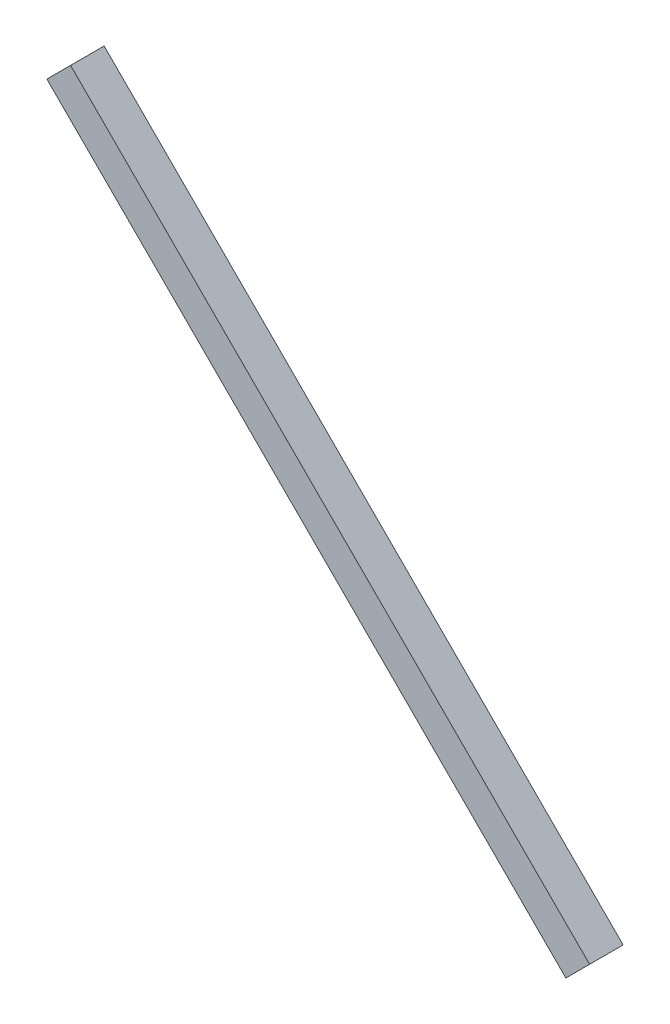
ISO-10303-21;
HEADER;
FILE_DESCRIPTION(('STEP AP214'),'2;1');
FILE_NAME('part.step','',(''),(''),'','','');
FILE_SCHEMA(('AUTOMOTIVE_DESIGN { 1 0 10303 214 1 1 1 1 }'));
ENDSEC;
DATA;
#1=APPLICATION_CONTEXT('core data for automotive mechanical design processes');
#2=APPLICATION_PROTOCOL_DEFINITION('international standard','automotive_design',2000,#1);
#3=PRODUCT_CONTEXT('',#1,'mechanical');
#4=PRODUCT('Part','Part','',(#3));
#5=PRODUCT_RELATED_PRODUCT_CATEGORY('part','',(#4));
#6=PRODUCT_DEFINITION_FORMATION('','',#4);
#7=PRODUCT_DEFINITION_CONTEXT('part definition',#1,'design');
#8=PRODUCT_DEFINITION('design','',#6,#7);
#9=PRODUCT_DEFINITION_SHAPE('','',#8);
#10=(LENGTH_UNIT() NAMED_UNIT(*) SI_UNIT(.MILLI.,.METRE.));
#11=(NAMED_UNIT(*) PLANE_ANGLE_UNIT() SI_UNIT($,.RADIAN.));
#12=(NAMED_UNIT(*) SI_UNIT($,.STERADIAN.) SOLID_ANGLE_UNIT());
#13=UNCERTAINTY_MEASURE_WITH_UNIT(LENGTH_MEASURE(1.E-05),#10,'distance_accuracy_value','');
#14=(GEOMETRIC_REPRESENTATION_CONTEXT(3) GLOBAL_UNCERTAINTY_ASSIGNED_CONTEXT((#13)) GLOBAL_UNIT_ASSIGNED_CONTEXT((#10,
#11,#12)) REPRESENTATION_CONTEXT('',''));
#15=CARTESIAN_POINT('',(0.,0.,0.));
#16=DIRECTION('',(0.,0.,1.));
#17=DIRECTION('',(1.,0.,0.));
#18=AXIS2_PLACEMENT_3D('',#15,#16,#17);
#19=CARTESIAN_POINT('',(324.738023329125,-15.556349186104,92.));
#20=DIRECTION('',(0.707106781186544,-0.707106781186551,0.));
#21=DIRECTION('',(0.,0.,-1.));
#22=AXIS2_PLACEMENT_3D('',#19,#20,#21);
#23=PLANE('',#22);
#24=DIRECTION('',(-0.707106781186551,-0.707106781186544,0.));
#25=VECTOR('',#24,1.);
#26=CARTESIAN_POINT('',(340.294372515229,0.,92.));
#27=LINE('',#26,#25);
#28=CARTESIAN_POINT('',(340.294372515229,0.,92.));
#29=VERTEX_POINT('',#28);
#30=CARTESIAN_POINT('',(324.738023329125,-15.556349186104,92.));
#31=VERTEX_POINT('',#30);
#32=EDGE_CURVE('E38',#29,#31,#27,.T.);
#33=ORIENTED_EDGE('',*,*,#32,.F.);
#34=DIRECTION('',(0.,0.,1.));
#35=VECTOR('',#34,1.);
#36=CARTESIAN_POINT('',(340.294372515229,0.,92.));
#37=LINE('',#36,#35);
#38=CARTESIAN_POINT('',(340.294372515229,0.,114.));
#39=VERTEX_POINT('',#38);
#40=EDGE_CURVE('E11',#29,#39,#37,.T.);
#41=ORIENTED_EDGE('',*,*,#40,.T.);
#42=DIRECTION('',(0.707106781186551,0.707106781186544,0.));
#43=VECTOR('',#42,1.);
#44=CARTESIAN_POINT('',(340.294372515229,0.,114.));
#45=LINE('',#44,#43);
#46=CARTESIAN_POINT('',(324.738023329125,-15.5563491861039,114.));
#47=VERTEX_POINT('',#46);
#48=EDGE_CURVE('E63',#47,#39,#45,.T.);
#49=ORIENTED_EDGE('',*,*,#48,.F.);
#50=DIRECTION('',(0.,0.,1.));
#51=VECTOR('',#50,1.);
#52=CARTESIAN_POINT('',(324.738023329125,-15.556349186104,92.));
#53=LINE('',#52,#51);
#54=EDGE_CURVE('E26',#31,#47,#53,.T.);
#55=ORIENTED_EDGE('',*,*,#54,.F.);
#56=EDGE_LOOP('',(#33,#41,#49,#55));
#57=FACE_BOUND('',#56,.T.);
#58=ADVANCED_FACE('F16',(#57),#23,.T.);
#59=CARTESIAN_POINT('',(-15.556349186104,324.738023329125,92.));
#60=DIRECTION('',(-0.707106781186548,-0.707106781186548,0.));
#61=DIRECTION('',(-0.707106781186548,0.707106781186548,0.));
#62=AXIS2_PLACEMENT_3D('',#59,#60,#61);
#63=PLANE('',#62);
#64=DIRECTION('',(-0.707106781186548,0.707106781186548,0.));
#65=VECTOR('',#64,1.);
#66=CARTESIAN_POINT('',(324.738023329125,-15.556349186104,92.));
#67=LINE('',#66,#65);
#68=CARTESIAN_POINT('',(-15.556349186104,324.738023329125,92.));
#69=VERTEX_POINT('',#68);
#70=EDGE_CURVE('E78',#31,#69,#67,.T.);
#71=ORIENTED_EDGE('',*,*,#70,.F.);
#72=ORIENTED_EDGE('',*,*,#54,.T.);
#73=DIRECTION('',(0.707106781186548,-0.707106781186548,0.));
#74=VECTOR('',#73,1.);
#75=CARTESIAN_POINT('',(324.738023329125,-15.556349186104,114.));
#76=LINE('',#75,#74);
#77=CARTESIAN_POINT('',(-15.556349186104,324.738023329125,114.));
#78=VERTEX_POINT('',#77);
#79=EDGE_CURVE('E71',#78,#47,#76,.T.);
#80=ORIENTED_EDGE('',*,*,#79,.F.);
#81=DIRECTION('',(0.,0.,1.));
#82=VECTOR('',#81,1.);
#83=CARTESIAN_POINT('',(-15.556349186104,324.738023329125,92.));
#84=LINE('',#83,#82);
#85=EDGE_CURVE('E19',#69,#78,#84,.T.);
#86=ORIENTED_EDGE('',*,*,#85,.F.);
#87=EDGE_LOOP('',(#71,#72,#80,#86));
#88=FACE_BOUND('',#87,.T.);
#89=ADVANCED_FACE('F75',(#88),#63,.T.);
#90=CARTESIAN_POINT('',(0.,340.294372515229,92.));
#91=DIRECTION('',(-0.707106781186548,0.707106781186547,0.));
#92=DIRECTION('',(0.,0.,1.));
#93=AXIS2_PLACEMENT_3D('',#90,#91,#92);
#94=PLANE('',#93);
#95=DIRECTION('',(0.707106781186547,0.707106781186548,0.));
#96=VECTOR('',#95,1.);
#97=CARTESIAN_POINT('',(-15.556349186104,324.738023329125,92.));
#98=LINE('',#97,#96);
#99=CARTESIAN_POINT('',(0.,340.294372515229,92.));
#100=VERTEX_POINT('',#99);
#101=EDGE_CURVE('E95',#69,#100,#98,.T.);
#102=ORIENTED_EDGE('',*,*,#101,.F.);
#103=ORIENTED_EDGE('',*,*,#85,.T.);
#104=DIRECTION('',(-0.707106781186547,-0.707106781186548,0.));
#105=VECTOR('',#104,1.);
#106=CARTESIAN_POINT('',(-15.556349186104,324.738023329125,114.));
#107=LINE('',#106,#105);
#108=CARTESIAN_POINT('',(0.,340.294372515229,114.));
#109=VERTEX_POINT('',#108);
#110=EDGE_CURVE('E84',#109,#78,#107,.T.);
#111=ORIENTED_EDGE('',*,*,#110,.F.);
#112=DIRECTION('',(0.,0.,1.));
#113=VECTOR('',#112,1.);
#114=CARTESIAN_POINT('',(0.,340.294372515229,92.));
#115=LINE('',#114,#113);
#116=EDGE_CURVE('E96',#100,#109,#115,.T.);
#117=ORIENTED_EDGE('',*,*,#116,.F.);
#118=EDGE_LOOP('',(#102,#103,#111,#117));
#119=FACE_BOUND('',#118,.T.);
#120=ADVANCED_FACE('F121',(#119),#94,.T.);
#121=CARTESIAN_POINT('',(340.294372515229,0.,92.));
#122=DIRECTION('',(0.707106781186547,0.707106781186548,0.));
#123=DIRECTION('',(0.,0.,-1.));
#124=AXIS2_PLACEMENT_3D('',#121,#122,#123);
#125=PLANE('',#124);
#126=DIRECTION('',(0.707106781186548,-0.707106781186547,0.));
#127=VECTOR('',#126,1.);
#128=CARTESIAN_POINT('',(0.,340.294372515229,92.));
#129=LINE('',#128,#127);
#130=EDGE_CURVE('E72',#100,#29,#129,.T.);
#131=ORIENTED_EDGE('',*,*,#130,.F.);
#132=ORIENTED_EDGE('',*,*,#116,.T.);
#133=DIRECTION('',(-0.707106781186548,0.707106781186547,0.));
#134=VECTOR('',#133,1.);
#135=CARTESIAN_POINT('',(0.,340.294372515229,114.));
#136=LINE('',#135,#134);
#137=EDGE_CURVE('E91',#39,#109,#136,.T.);
#138=ORIENTED_EDGE('',*,*,#137,.F.);
#139=ORIENTED_EDGE('',*,*,#40,.F.);
#140=EDGE_LOOP('',(#131,#132,#138,#139));
#141=FACE_BOUND('',#140,.T.);
#142=ADVANCED_FACE('F122',(#141),#125,.T.);
#143=CARTESIAN_POINT('',(162.369011664562,162.369011664562,114.));
#144=DIRECTION('',(0.,0.,1.));
#145=DIRECTION('',(1.,0.,0.));
#146=AXIS2_PLACEMENT_3D('',#143,#144,#145);
#147=PLANE('',#146);
#148=ORIENTED_EDGE('',*,*,#137,.T.);
#149=ORIENTED_EDGE('',*,*,#110,.T.);
#150=ORIENTED_EDGE('',*,*,#79,.T.);
#151=ORIENTED_EDGE('',*,*,#48,.T.);
#152=EDGE_LOOP('',(#148,#149,#150,#151));
#153=FACE_BOUND('',#152,.T.);
#154=ADVANCED_FACE('F82',(#153),#147,.T.);
#155=CARTESIAN_POINT('',(162.369011664562,162.369011664562,92.));
#156=DIRECTION('',(0.,0.,1.));
#157=DIRECTION('',(1.,0.,0.));
#158=AXIS2_PLACEMENT_3D('',#155,#156,#157);
#159=PLANE('',#158);
#160=ORIENTED_EDGE('',*,*,#130,.T.);
#161=ORIENTED_EDGE('',*,*,#32,.T.);
#162=ORIENTED_EDGE('',*,*,#70,.T.);
#163=ORIENTED_EDGE('',*,*,#101,.T.);
#164=EDGE_LOOP('',(#160,#161,#162,#163));
#165=FACE_BOUND('',#164,.T.);
#166=ADVANCED_FACE('F119',(#165),#159,.F.);
#167=CLOSED_SHELL('',(#58,#89,#120,#142,#154,#166));
#168=MANIFOLD_SOLID_BREP('B1',#167);
#169=ADVANCED_BREP_SHAPE_REPRESENTATION('',(#18,#168),#14);
#170=SHAPE_DEFINITION_REPRESENTATION(#9,#169);
ENDSEC;
END-ISO-10303-21;
